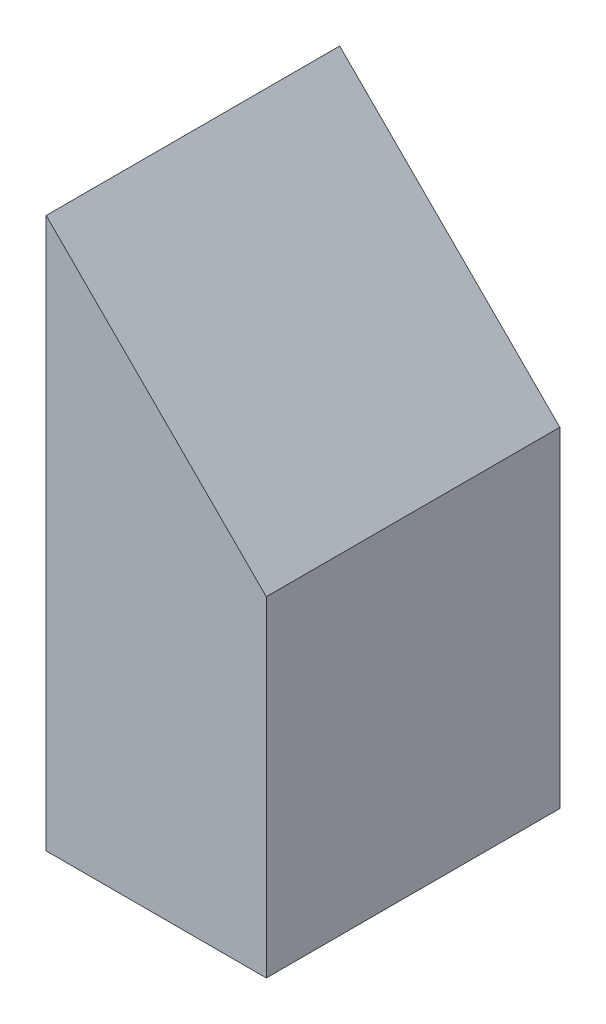
ISO-10303-21;
HEADER;
FILE_DESCRIPTION(('STEP AP214'),'2;1');
FILE_NAME('part.step','',(''),(''),'','','');
FILE_SCHEMA(('AUTOMOTIVE_DESIGN { 1 0 10303 214 1 1 1 1 }'));
ENDSEC;
DATA;
#1=APPLICATION_CONTEXT('core data for automotive mechanical design processes');
#2=APPLICATION_PROTOCOL_DEFINITION('international standard','automotive_design',2000,#1);
#3=PRODUCT_CONTEXT('',#1,'mechanical');
#4=PRODUCT('Part','Part','',(#3));
#5=PRODUCT_RELATED_PRODUCT_CATEGORY('part','',(#4));
#6=PRODUCT_DEFINITION_FORMATION('','',#4);
#7=PRODUCT_DEFINITION_CONTEXT('part definition',#1,'design');
#8=PRODUCT_DEFINITION('design','',#6,#7);
#9=PRODUCT_DEFINITION_SHAPE('','',#8);
#10=(LENGTH_UNIT() NAMED_UNIT(*) SI_UNIT(.MILLI.,.METRE.));
#11=(NAMED_UNIT(*) PLANE_ANGLE_UNIT() SI_UNIT($,.RADIAN.));
#12=(NAMED_UNIT(*) SI_UNIT($,.STERADIAN.) SOLID_ANGLE_UNIT());
#13=UNCERTAINTY_MEASURE_WITH_UNIT(LENGTH_MEASURE(1.E-05),#10,'distance_accuracy_value','');
#14=(GEOMETRIC_REPRESENTATION_CONTEXT(3) GLOBAL_UNCERTAINTY_ASSIGNED_CONTEXT((#13)) GLOBAL_UNIT_ASSIGNED_CONTEXT((#10,
#11,#12)) REPRESENTATION_CONTEXT('',''));
#15=CARTESIAN_POINT('',(0.,0.,0.));
#16=DIRECTION('',(0.,0.,1.));
#17=DIRECTION('',(1.,0.,0.));
#18=AXIS2_PLACEMENT_3D('',#15,#16,#17);
#19=CARTESIAN_POINT('',(19.05,95.25,25.4));
#20=DIRECTION('',(-1.,0.,0.));
#21=DIRECTION('',(0.,0.,1.));
#22=AXIS2_PLACEMENT_3D('',#19,#20,#21);
#23=PLANE('',#22);
#24=DIRECTION('',(0.,0.,-1.));
#25=VECTOR('',#24,1.);
#26=CARTESIAN_POINT('',(19.05,57.1500000000001,174.845316244977));
#27=LINE('',#26,#25);
#28=CARTESIAN_POINT('',(19.05,57.1500000000002,25.4));
#29=VERTEX_POINT('',#28);
#30=CARTESIAN_POINT('',(19.05,57.1500000000002,-25.4));
#31=VERTEX_POINT('',#30);
#32=EDGE_CURVE('E53',#29,#31,#27,.T.);
#33=ORIENTED_EDGE('',*,*,#32,.F.);
#34=DIRECTION('',(0.,-1.,0.));
#35=VECTOR('',#34,1.);
#36=CARTESIAN_POINT('',(19.05,95.25,25.4));
#37=LINE('',#36,#35);
#38=CARTESIAN_POINT('',(19.05,0.,25.4));
#39=VERTEX_POINT('',#38);
#40=EDGE_CURVE('E83',#29,#39,#37,.T.);
#41=ORIENTED_EDGE('',*,*,#40,.T.);
#42=DIRECTION('',(0.,0.,-1.));
#43=VECTOR('',#42,1.);
#44=CARTESIAN_POINT('',(19.05,0.,25.4));
#45=LINE('',#44,#43);
#46=CARTESIAN_POINT('',(19.05,0.,-25.4));
#47=VERTEX_POINT('',#46);
#48=EDGE_CURVE('E97',#39,#47,#45,.T.);
#49=ORIENTED_EDGE('',*,*,#48,.T.);
#50=DIRECTION('',(0.,-1.,0.));
#51=VECTOR('',#50,1.);
#52=CARTESIAN_POINT('',(19.05,95.25,-25.4));
#53=LINE('',#52,#51);
#54=EDGE_CURVE('E11',#31,#47,#53,.T.);
#55=ORIENTED_EDGE('',*,*,#54,.F.);
#56=EDGE_LOOP('',(#33,#41,#49,#55));
#57=FACE_BOUND('',#56,.T.);
#58=ADVANCED_FACE('F33',(#57),#23,.F.);
#59=CARTESIAN_POINT('',(19.05,95.25,-25.4));
#60=DIRECTION('',(0.,0.,1.));
#61=DIRECTION('',(1.,0.,0.));
#62=AXIS2_PLACEMENT_3D('',#59,#60,#61);
#63=PLANE('',#62);
#64=DIRECTION('',(-0.707106781186549,0.707106781186546,0.));
#65=VECTOR('',#64,1.);
#66=CARTESIAN_POINT('',(0.,76.2,-25.4));
#67=LINE('',#66,#65);
#68=CARTESIAN_POINT('',(-19.05,95.25,-25.4));
#69=VERTEX_POINT('',#68);
#70=EDGE_CURVE('E46',#31,#69,#67,.T.);
#71=ORIENTED_EDGE('',*,*,#70,.F.);
#72=ORIENTED_EDGE('',*,*,#54,.T.);
#73=DIRECTION('',(-1.,0.,0.));
#74=VECTOR('',#73,1.);
#75=CARTESIAN_POINT('',(19.05,0.,-25.4));
#76=LINE('',#75,#74);
#77=CARTESIAN_POINT('',(-19.05,0.,-25.4));
#78=VERTEX_POINT('',#77);
#79=EDGE_CURVE('E100',#47,#78,#76,.T.);
#80=ORIENTED_EDGE('',*,*,#79,.T.);
#81=DIRECTION('',(0.,-1.,0.));
#82=VECTOR('',#81,1.);
#83=CARTESIAN_POINT('',(-19.05,95.25,-25.4));
#84=LINE('',#83,#82);
#85=EDGE_CURVE('E40',#69,#78,#84,.T.);
#86=ORIENTED_EDGE('',*,*,#85,.F.);
#87=EDGE_LOOP('',(#71,#72,#80,#86));
#88=FACE_BOUND('',#87,.T.);
#89=ADVANCED_FACE('F107',(#88),#63,.F.);
#90=CARTESIAN_POINT('',(-19.05,95.25,25.4));
#91=DIRECTION('',(0.,0.,-1.));
#92=DIRECTION('',(-1.,0.,0.));
#93=AXIS2_PLACEMENT_3D('',#90,#91,#92);
#94=PLANE('',#93);
#95=DIRECTION('',(0.707106781186549,-0.707106781186546,0.));
#96=VECTOR('',#95,1.);
#97=CARTESIAN_POINT('',(-19.05,95.25,25.4));
#98=LINE('',#97,#96);
#99=CARTESIAN_POINT('',(-19.05,95.25,25.4));
#100=VERTEX_POINT('',#99);
#101=EDGE_CURVE('E86',#100,#29,#98,.T.);
#102=ORIENTED_EDGE('',*,*,#101,.F.);
#103=DIRECTION('',(0.,-1.,0.));
#104=VECTOR('',#103,1.);
#105=CARTESIAN_POINT('',(-19.05,95.25,25.4));
#106=LINE('',#105,#104);
#107=CARTESIAN_POINT('',(-19.05,0.,25.4));
#108=VERTEX_POINT('',#107);
#109=EDGE_CURVE('E72',#100,#108,#106,.T.);
#110=ORIENTED_EDGE('',*,*,#109,.T.);
#111=DIRECTION('',(1.,0.,0.));
#112=VECTOR('',#111,1.);
#113=CARTESIAN_POINT('',(-19.05,0.,25.4));
#114=LINE('',#113,#112);
#115=EDGE_CURVE('E91',#108,#39,#114,.T.);
#116=ORIENTED_EDGE('',*,*,#115,.T.);
#117=ORIENTED_EDGE('',*,*,#40,.F.);
#118=EDGE_LOOP('',(#102,#110,#116,#117));
#119=FACE_BOUND('',#118,.T.);
#120=ADVANCED_FACE('F87',(#119),#94,.F.);
#121=CARTESIAN_POINT('',(-19.05,95.25,-25.4));
#122=DIRECTION('',(1.,0.,0.));
#123=DIRECTION('',(0.,0.,-1.));
#124=AXIS2_PLACEMENT_3D('',#121,#122,#123);
#125=PLANE('',#124);
#126=DIRECTION('',(0.,0.,1.));
#127=VECTOR('',#126,1.);
#128=CARTESIAN_POINT('',(-19.05,0.,-25.4));
#129=LINE('',#128,#127);
#130=EDGE_CURVE('E79',#78,#108,#129,.T.);
#131=ORIENTED_EDGE('',*,*,#130,.T.);
#132=ORIENTED_EDGE('',*,*,#109,.F.);
#133=DIRECTION('',(0.,0.,1.));
#134=VECTOR('',#133,1.);
#135=CARTESIAN_POINT('',(-19.05,95.25,-25.4));
#136=LINE('',#135,#134);
#137=EDGE_CURVE('E77',#69,#100,#136,.T.);
#138=ORIENTED_EDGE('',*,*,#137,.F.);
#139=ORIENTED_EDGE('',*,*,#85,.T.);
#140=EDGE_LOOP('',(#131,#132,#138,#139));
#141=FACE_BOUND('',#140,.T.);
#142=ADVANCED_FACE('F74',(#141),#125,.F.);
#143=CARTESIAN_POINT('',(0.,0.,0.));
#144=DIRECTION('',(0.,1.,0.));
#145=DIRECTION('',(0.,0.,1.));
#146=AXIS2_PLACEMENT_3D('',#143,#144,#145);
#147=PLANE('',#146);
#148=ORIENTED_EDGE('',*,*,#48,.F.);
#149=ORIENTED_EDGE('',*,*,#115,.F.);
#150=ORIENTED_EDGE('',*,*,#130,.F.);
#151=ORIENTED_EDGE('',*,*,#79,.F.);
#152=EDGE_LOOP('',(#148,#149,#150,#151));
#153=FACE_BOUND('',#152,.T.);
#154=ADVANCED_FACE('F105',(#153),#147,.F.);
#155=CARTESIAN_POINT('',(-19.05,95.25,174.845316244977));
#156=DIRECTION('',(0.707106781186546,0.707106781186549,0.));
#157=DIRECTION('',(-0.707106781186549,0.707106781186546,0.));
#158=AXIS2_PLACEMENT_3D('',#155,#156,#157);
#159=PLANE('',#158);
#160=ORIENTED_EDGE('',*,*,#32,.T.);
#161=ORIENTED_EDGE('',*,*,#70,.T.);
#162=ORIENTED_EDGE('',*,*,#137,.T.);
#163=ORIENTED_EDGE('',*,*,#101,.T.);
#164=EDGE_LOOP('',(#160,#161,#162,#163));
#165=FACE_BOUND('',#164,.T.);
#166=ADVANCED_FACE('F90',(#165),#159,.T.);
#167=CLOSED_SHELL('',(#58,#89,#120,#142,#154,#166));
#168=MANIFOLD_SOLID_BREP('B2',#167);
#169=ADVANCED_BREP_SHAPE_REPRESENTATION('',(#18,#168),#14);
#170=SHAPE_DEFINITION_REPRESENTATION(#9,#169);
ENDSEC;
END-ISO-10303-21;
